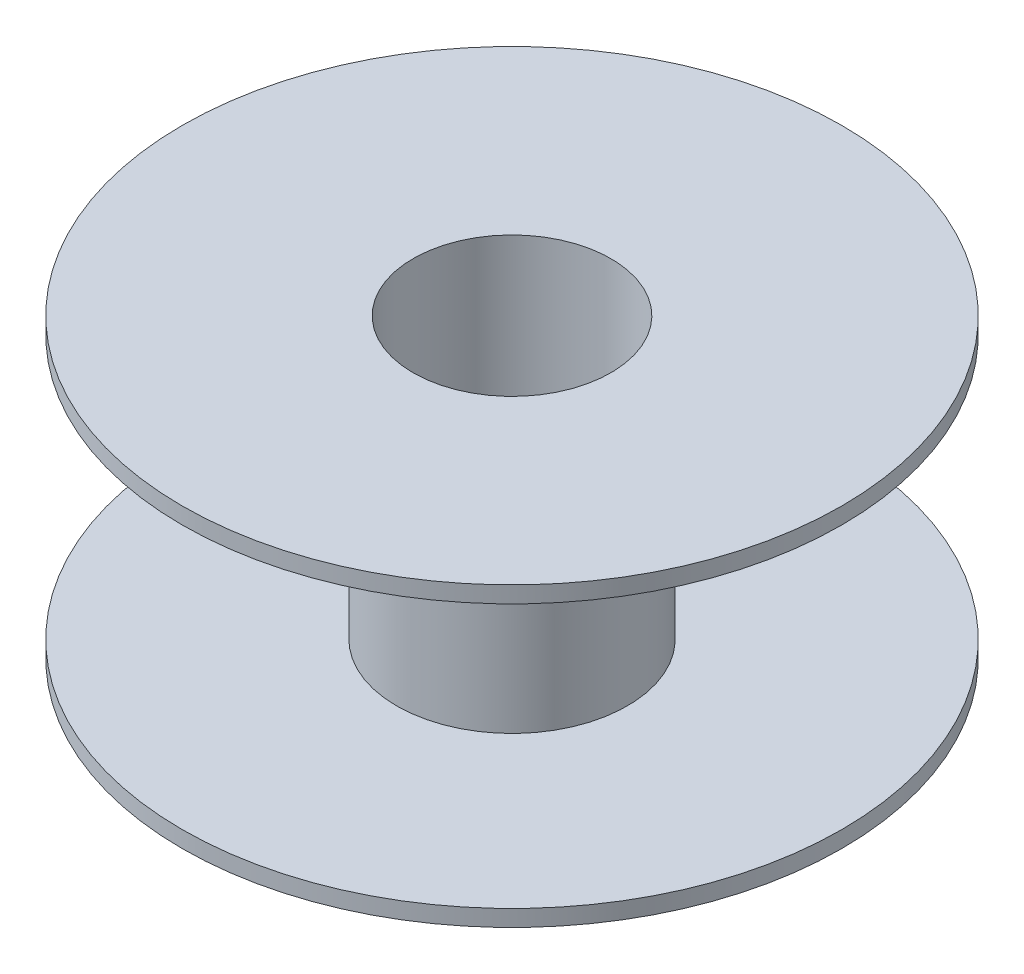
ISO-10303-21;
HEADER;
FILE_DESCRIPTION(('STEP AP214'),'2;1');
FILE_NAME('part.step','',(''),(''),'','','');
FILE_SCHEMA(('AUTOMOTIVE_DESIGN { 1 0 10303 214 1 1 1 1 }'));
ENDSEC;
DATA;
#1=APPLICATION_CONTEXT('core data for automotive mechanical design processes');
#2=APPLICATION_PROTOCOL_DEFINITION('international standard','automotive_design',2000,#1);
#3=PRODUCT_CONTEXT('',#1,'mechanical');
#4=PRODUCT('Part','Part','',(#3));
#5=PRODUCT_RELATED_PRODUCT_CATEGORY('part','',(#4));
#6=PRODUCT_DEFINITION_FORMATION('','',#4);
#7=PRODUCT_DEFINITION_CONTEXT('part definition',#1,'design');
#8=PRODUCT_DEFINITION('design','',#6,#7);
#9=PRODUCT_DEFINITION_SHAPE('','',#8);
#10=(LENGTH_UNIT() NAMED_UNIT(*) SI_UNIT(.MILLI.,.METRE.));
#11=(NAMED_UNIT(*) PLANE_ANGLE_UNIT() SI_UNIT($,.RADIAN.));
#12=(NAMED_UNIT(*) SI_UNIT($,.STERADIAN.) SOLID_ANGLE_UNIT());
#13=UNCERTAINTY_MEASURE_WITH_UNIT(LENGTH_MEASURE(1.E-05),#10,'distance_accuracy_value','');
#14=(GEOMETRIC_REPRESENTATION_CONTEXT(3) GLOBAL_UNCERTAINTY_ASSIGNED_CONTEXT((#13)) GLOBAL_UNIT_ASSIGNED_CONTEXT((#10,
#11,#12)) REPRESENTATION_CONTEXT('',''));
#15=CARTESIAN_POINT('',(0.,0.,0.));
#16=DIRECTION('',(0.,0.,1.));
#17=DIRECTION('',(1.,0.,0.));
#18=AXIS2_PLACEMENT_3D('',#15,#16,#17);
#19=CARTESIAN_POINT('',(0.,5.,0.));
#20=DIRECTION('',(0.,1.,0.));
#21=DIRECTION('',(0.,0.,1.));
#22=AXIS2_PLACEMENT_3D('',#19,#20,#21);
#23=PLANE('',#22);
#24=CARTESIAN_POINT('',(0.,5.,0.));
#25=DIRECTION('',(0.,1.,0.));
#26=DIRECTION('',(0.,0.,1.));
#27=AXIS2_PLACEMENT_3D('',#24,#25,#26);
#28=CIRCLE('',#27,100.);
#29=CARTESIAN_POINT('',(0.,5.,100.));
#30=VERTEX_POINT('',#29);
#31=EDGE_CURVE('E10',#30,#30,#28,.T.);
#32=ORIENTED_EDGE('',*,*,#31,.T.);
#33=EDGE_LOOP('',(#32));
#34=FACE_BOUND('',#33,.T.);
#35=CARTESIAN_POINT('',(0.,5.,0.));
#36=DIRECTION('',(0.,1.,0.));
#37=DIRECTION('',(0.,0.,1.));
#38=AXIS2_PLACEMENT_3D('',#35,#36,#37);
#39=CIRCLE('',#38,35.);
#40=CARTESIAN_POINT('',(0.,5.,35.));
#41=VERTEX_POINT('',#40);
#42=EDGE_CURVE('E46',#41,#41,#39,.T.);
#43=ORIENTED_EDGE('',*,*,#42,.F.);
#44=EDGE_LOOP('',(#43));
#45=FACE_BOUND('',#44,.T.);
#46=ADVANCED_FACE('F31',(#34,#45),#23,.T.);
#47=CARTESIAN_POINT('',(0.,0.,0.));
#48=DIRECTION('',(0.,1.,0.));
#49=DIRECTION('',(0.,0.,1.));
#50=AXIS2_PLACEMENT_3D('',#47,#48,#49);
#51=PLANE('',#50);
#52=CARTESIAN_POINT('',(0.,0.,0.));
#53=DIRECTION('',(0.,1.,0.));
#54=DIRECTION('',(0.,0.,1.));
#55=AXIS2_PLACEMENT_3D('',#52,#53,#54);
#56=CIRCLE('',#55,100.);
#57=CARTESIAN_POINT('',(0.,0.,100.));
#58=VERTEX_POINT('',#57);
#59=EDGE_CURVE('E35',#58,#58,#56,.T.);
#60=ORIENTED_EDGE('',*,*,#59,.F.);
#61=EDGE_LOOP('',(#60));
#62=FACE_BOUND('',#61,.T.);
#63=CARTESIAN_POINT('',(0.,0.,0.));
#64=DIRECTION('',(0.,1.,0.));
#65=DIRECTION('',(0.,0.,1.));
#66=AXIS2_PLACEMENT_3D('',#63,#64,#65);
#67=CIRCLE('',#66,30.);
#68=CARTESIAN_POINT('',(0.,0.,30.));
#69=VERTEX_POINT('',#68);
#70=EDGE_CURVE('E42',#69,#69,#67,.T.);
#71=ORIENTED_EDGE('',*,*,#70,.T.);
#72=EDGE_LOOP('',(#71));
#73=FACE_BOUND('',#72,.T.);
#74=ADVANCED_FACE('F80',(#62,#73),#51,.F.);
#75=CARTESIAN_POINT('',(0.,5.,0.));
#76=DIRECTION('',(0.,-1.,0.));
#77=DIRECTION('',(0.,0.,-1.));
#78=AXIS2_PLACEMENT_3D('',#75,#76,#77);
#79=CYLINDRICAL_SURFACE('',#78,100.);
#80=ORIENTED_EDGE('',*,*,#31,.F.);
#81=EDGE_LOOP('',(#80));
#82=FACE_BOUND('',#81,.T.);
#83=ORIENTED_EDGE('',*,*,#59,.T.);
#84=EDGE_LOOP('',(#83));
#85=FACE_BOUND('',#84,.T.);
#86=ADVANCED_FACE('F33',(#82,#85),#79,.T.);
#87=CARTESIAN_POINT('',(0.,5.,0.));
#88=DIRECTION('',(0.,-1.,0.));
#89=DIRECTION('',(0.,0.,-1.));
#90=AXIS2_PLACEMENT_3D('',#87,#88,#89);
#91=CYLINDRICAL_SURFACE('',#90,30.);
#92=ORIENTED_EDGE('',*,*,#70,.F.);
#93=EDGE_LOOP('',(#92));
#94=FACE_BOUND('',#93,.T.);
#95=CARTESIAN_POINT('',(0.,90.,0.));
#96=DIRECTION('',(0.,1.,0.));
#97=DIRECTION('',(0.,0.,1.));
#98=AXIS2_PLACEMENT_3D('',#95,#96,#97);
#99=CIRCLE('',#98,30.);
#100=CARTESIAN_POINT('',(0.,90.,30.));
#101=VERTEX_POINT('',#100);
#102=EDGE_CURVE('E53',#101,#101,#99,.T.);
#103=ORIENTED_EDGE('',*,*,#102,.T.);
#104=EDGE_LOOP('',(#103));
#105=FACE_BOUND('',#104,.T.);
#106=ADVANCED_FACE('F66',(#94,#105),#91,.F.);
#107=CARTESIAN_POINT('',(0.,45.,0.));
#108=DIRECTION('',(0.,-1.,0.));
#109=DIRECTION('',(0.,0.,-1.));
#110=AXIS2_PLACEMENT_3D('',#107,#108,#109);
#111=CYLINDRICAL_SURFACE('',#110,35.);
#112=ORIENTED_EDGE('',*,*,#42,.T.);
#113=EDGE_LOOP('',(#112));
#114=FACE_BOUND('',#113,.T.);
#115=CARTESIAN_POINT('',(0.,85.,0.));
#116=DIRECTION('',(0.,1.,0.));
#117=DIRECTION('',(0.,0.,1.));
#118=AXIS2_PLACEMENT_3D('',#115,#116,#117);
#119=CIRCLE('',#118,35.);
#120=CARTESIAN_POINT('',(0.,85.,35.));
#121=VERTEX_POINT('',#120);
#122=EDGE_CURVE('E58',#121,#121,#119,.T.);
#123=ORIENTED_EDGE('',*,*,#122,.F.);
#124=EDGE_LOOP('',(#123));
#125=FACE_BOUND('',#124,.T.);
#126=ADVANCED_FACE('F64',(#114,#125),#111,.T.);
#127=CARTESIAN_POINT('',(0.,85.,0.));
#128=DIRECTION('',(0.,-1.,0.));
#129=DIRECTION('',(0.,0.,1.));
#130=AXIS2_PLACEMENT_3D('',#127,#128,#129);
#131=PLANE('',#130);
#132=CARTESIAN_POINT('',(0.,85.,0.));
#133=DIRECTION('',(0.,1.,0.));
#134=DIRECTION('',(0.,0.,1.));
#135=AXIS2_PLACEMENT_3D('',#132,#133,#134);
#136=CIRCLE('',#135,100.);
#137=CARTESIAN_POINT('',(0.,85.,100.));
#138=VERTEX_POINT('',#137);
#139=EDGE_CURVE('E49',#138,#138,#136,.T.);
#140=ORIENTED_EDGE('',*,*,#139,.F.);
#141=EDGE_LOOP('',(#140));
#142=FACE_BOUND('',#141,.T.);
#143=ORIENTED_EDGE('',*,*,#122,.T.);
#144=EDGE_LOOP('',(#143));
#145=FACE_BOUND('',#144,.T.);
#146=ADVANCED_FACE('F62',(#142,#145),#131,.T.);
#147=CARTESIAN_POINT('',(0.,90.,0.));
#148=DIRECTION('',(0.,-1.,0.));
#149=DIRECTION('',(0.,0.,1.));
#150=AXIS2_PLACEMENT_3D('',#147,#148,#149);
#151=PLANE('',#150);
#152=CARTESIAN_POINT('',(0.,90.,0.));
#153=DIRECTION('',(0.,1.,0.));
#154=DIRECTION('',(0.,0.,1.));
#155=AXIS2_PLACEMENT_3D('',#152,#153,#154);
#156=CIRCLE('',#155,100.);
#157=CARTESIAN_POINT('',(0.,90.,100.));
#158=VERTEX_POINT('',#157);
#159=EDGE_CURVE('E50',#158,#158,#156,.T.);
#160=ORIENTED_EDGE('',*,*,#159,.T.);
#161=EDGE_LOOP('',(#160));
#162=FACE_BOUND('',#161,.T.);
#163=ORIENTED_EDGE('',*,*,#102,.F.);
#164=EDGE_LOOP('',(#163));
#165=FACE_BOUND('',#164,.T.);
#166=ADVANCED_FACE('F73',(#162,#165),#151,.F.);
#167=CARTESIAN_POINT('',(0.,85.,0.));
#168=DIRECTION('',(0.,1.,0.));
#169=DIRECTION('',(0.,0.,-1.));
#170=AXIS2_PLACEMENT_3D('',#167,#168,#169);
#171=CYLINDRICAL_SURFACE('',#170,100.);
#172=ORIENTED_EDGE('',*,*,#139,.T.);
#173=EDGE_LOOP('',(#172));
#174=FACE_BOUND('',#173,.T.);
#175=ORIENTED_EDGE('',*,*,#159,.F.);
#176=EDGE_LOOP('',(#175));
#177=FACE_BOUND('',#176,.T.);
#178=ADVANCED_FACE('F99',(#174,#177),#171,.T.);
#179=CLOSED_SHELL('',(#46,#74,#86,#106,#126,#146,#166,#178));
#180=MANIFOLD_SOLID_BREP('B2',#179);
#181=ADVANCED_BREP_SHAPE_REPRESENTATION('',(#18,#180),#14);
#182=SHAPE_DEFINITION_REPRESENTATION(#9,#181);
ENDSEC;
END-ISO-10303-21;
